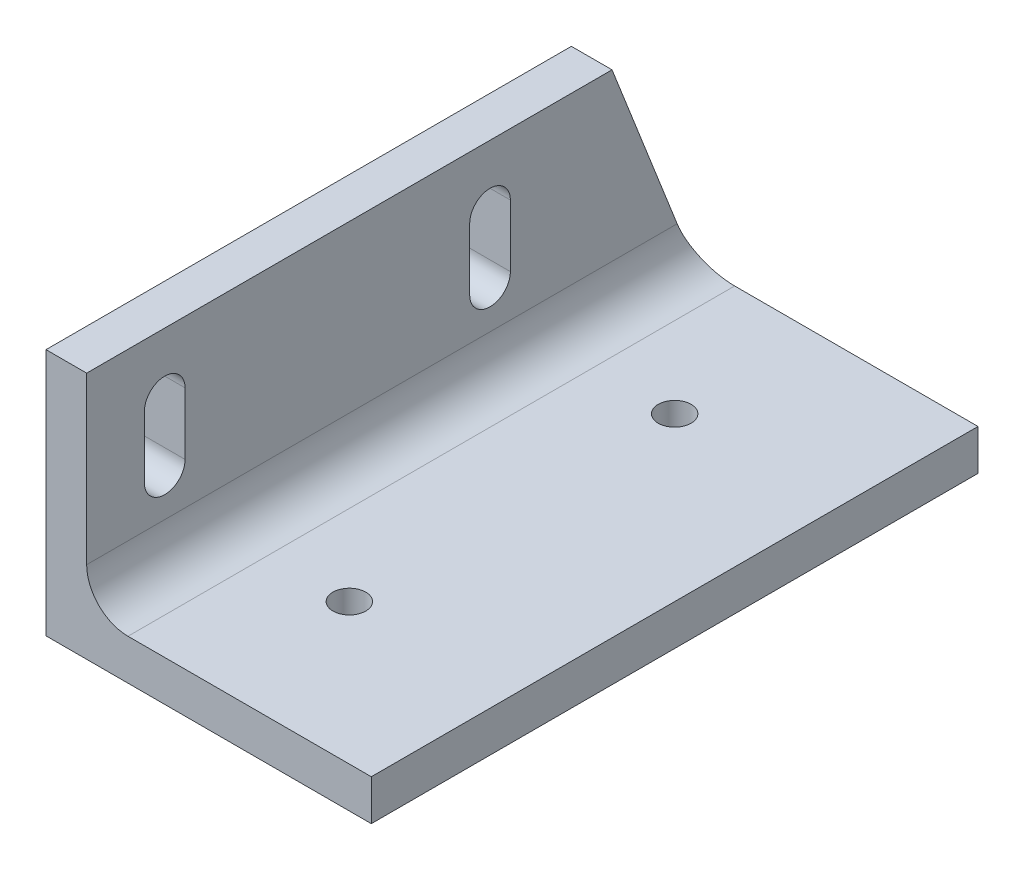
ISO-10303-21;
HEADER;
FILE_DESCRIPTION(('STEP AP214'),'2;1');
FILE_NAME('part.step','',(''),(''),'','','');
FILE_SCHEMA(('AUTOMOTIVE_DESIGN { 1 0 10303 214 1 1 1 1 }'));
ENDSEC;
DATA;
#1=APPLICATION_CONTEXT('core data for automotive mechanical design processes');
#2=APPLICATION_PROTOCOL_DEFINITION('international standard','automotive_design',2000,#1);
#3=PRODUCT_CONTEXT('',#1,'mechanical');
#4=PRODUCT('Part','Part','',(#3));
#5=PRODUCT_RELATED_PRODUCT_CATEGORY('part','',(#4));
#6=PRODUCT_DEFINITION_FORMATION('','',#4);
#7=PRODUCT_DEFINITION_CONTEXT('part definition',#1,'design');
#8=PRODUCT_DEFINITION('design','',#6,#7);
#9=PRODUCT_DEFINITION_SHAPE('','',#8);
#10=(LENGTH_UNIT() NAMED_UNIT(*) SI_UNIT(.MILLI.,.METRE.));
#11=(NAMED_UNIT(*) PLANE_ANGLE_UNIT() SI_UNIT($,.RADIAN.));
#12=(NAMED_UNIT(*) SI_UNIT($,.STERADIAN.) SOLID_ANGLE_UNIT());
#13=UNCERTAINTY_MEASURE_WITH_UNIT(LENGTH_MEASURE(1.E-05),#10,'distance_accuracy_value','');
#14=(GEOMETRIC_REPRESENTATION_CONTEXT(3) GLOBAL_UNCERTAINTY_ASSIGNED_CONTEXT((#13)) GLOBAL_UNIT_ASSIGNED_CONTEXT((#10,
#11,#12)) REPRESENTATION_CONTEXT('',''));
#15=CARTESIAN_POINT('',(0.,0.,0.));
#16=DIRECTION('',(0.,0.,1.));
#17=DIRECTION('',(1.,0.,0.));
#18=AXIS2_PLACEMENT_3D('',#15,#16,#17);
#19=CARTESIAN_POINT('',(-5.,25.48,74.6));
#20=DIRECTION('',(0.,-1.,0.));
#21=DIRECTION('',(0.,0.,-1.));
#22=AXIS2_PLACEMENT_3D('',#19,#20,#21);
#23=PLANE('',#22);
#24=DIRECTION('',(1.,0.,0.));
#25=VECTOR('',#24,1.);
#26=CARTESIAN_POINT('',(-10.,25.48,10.));
#27=LINE('',#26,#25);
#28=CARTESIAN_POINT('',(-5.,25.48,10.));
#29=VERTEX_POINT('',#28);
#30=CARTESIAN_POINT('',(0.,25.48,10.));
#31=VERTEX_POINT('',#30);
#32=EDGE_CURVE('E158',#29,#31,#27,.T.);
#33=ORIENTED_EDGE('',*,*,#32,.F.);
#34=DIRECTION('',(0.,0.,-1.));
#35=VECTOR('',#34,1.);
#36=CARTESIAN_POINT('',(-5.,25.48,74.6));
#37=LINE('',#36,#35);
#38=CARTESIAN_POINT('',(-5.,25.48,74.6));
#39=VERTEX_POINT('',#38);
#40=EDGE_CURVE('E188',#39,#29,#37,.T.);
#41=ORIENTED_EDGE('',*,*,#40,.F.);
#42=DIRECTION('',(-1.,0.,0.));
#43=VECTOR('',#42,1.);
#44=CARTESIAN_POINT('',(-5.,25.48,74.6));
#45=LINE('',#44,#43);
#46=CARTESIAN_POINT('',(0.,25.48,74.6));
#47=VERTEX_POINT('',#46);
#48=EDGE_CURVE('E170',#47,#39,#45,.T.);
#49=ORIENTED_EDGE('',*,*,#48,.F.);
#50=DIRECTION('',(0.,0.,-1.));
#51=VECTOR('',#50,1.);
#52=CARTESIAN_POINT('',(0.,25.48,74.6));
#53=LINE('',#52,#51);
#54=EDGE_CURVE('E152',#47,#31,#53,.T.);
#55=ORIENTED_EDGE('',*,*,#54,.T.);
#56=EDGE_LOOP('',(#33,#41,#49,#55));
#57=FACE_BOUND('',#56,.T.);
#58=ADVANCED_FACE('F35',(#57),#23,.F.);
#59=CARTESIAN_POINT('',(-5.,-5.,74.6));
#60=DIRECTION('',(1.,0.,0.));
#61=DIRECTION('',(0.,0.,-1.));
#62=AXIS2_PLACEMENT_3D('',#59,#60,#61);
#63=PLANE('',#62);
#64=DIRECTION('',(0.,-1.,0.));
#65=VECTOR('',#64,1.);
#66=CARTESIAN_POINT('',(-5.,10.24,67.5000000000004));
#67=LINE('',#66,#65);
#68=CARTESIAN_POINT('',(-5.,17.86,67.5000000000004));
#69=VERTEX_POINT('',#68);
#70=CARTESIAN_POINT('',(-5.,10.24,67.5000000000004));
#71=VERTEX_POINT('',#70);
#72=EDGE_CURVE('E273',#69,#71,#67,.T.);
#73=ORIENTED_EDGE('',*,*,#72,.T.);
#74=CARTESIAN_POINT('',(-5.,10.24,65.0000000000004));
#75=DIRECTION('',(1.,0.,0.));
#76=DIRECTION('',(0.,1.,0.));
#77=AXIS2_PLACEMENT_3D('',#74,#75,#76);
#78=CIRCLE('',#77,2.5);
#79=CARTESIAN_POINT('',(-5.,10.24,62.5000000000004));
#80=VERTEX_POINT('',#79);
#81=EDGE_CURVE('E263',#71,#80,#78,.T.);
#82=ORIENTED_EDGE('',*,*,#81,.T.);
#83=DIRECTION('',(0.,1.,0.));
#84=VECTOR('',#83,1.);
#85=CARTESIAN_POINT('',(-5.,10.24,62.5000000000004));
#86=LINE('',#85,#84);
#87=CARTESIAN_POINT('',(-5.,17.86,62.5000000000004));
#88=VERTEX_POINT('',#87);
#89=EDGE_CURVE('E266',#80,#88,#86,.T.);
#90=ORIENTED_EDGE('',*,*,#89,.T.);
#91=CARTESIAN_POINT('',(-5.,17.86,65.0000000000004));
#92=DIRECTION('',(1.,0.,0.));
#93=DIRECTION('',(0.,1.,0.));
#94=AXIS2_PLACEMENT_3D('',#91,#92,#93);
#95=CIRCLE('',#94,2.5);
#96=EDGE_CURVE('E270',#88,#69,#95,.T.);
#97=ORIENTED_EDGE('',*,*,#96,.T.);
#98=EDGE_LOOP('',(#73,#82,#90,#97));
#99=FACE_BOUND('',#98,.T.);
#100=DIRECTION('',(0.,-1.,0.));
#101=VECTOR('',#100,1.);
#102=CARTESIAN_POINT('',(-5.,10.24,27.5));
#103=LINE('',#102,#101);
#104=CARTESIAN_POINT('',(-5.,17.86,27.5));
#105=VERTEX_POINT('',#104);
#106=CARTESIAN_POINT('',(-5.,10.24,27.5));
#107=VERTEX_POINT('',#106);
#108=EDGE_CURVE('E243',#105,#107,#103,.T.);
#109=ORIENTED_EDGE('',*,*,#108,.T.);
#110=CARTESIAN_POINT('',(-5.,10.24,25.));
#111=DIRECTION('',(1.,0.,0.));
#112=DIRECTION('',(0.,1.,0.));
#113=AXIS2_PLACEMENT_3D('',#110,#111,#112);
#114=CIRCLE('',#113,2.5);
#115=CARTESIAN_POINT('',(-5.,10.24,22.5));
#116=VERTEX_POINT('',#115);
#117=EDGE_CURVE('E233',#107,#116,#114,.T.);
#118=ORIENTED_EDGE('',*,*,#117,.T.);
#119=DIRECTION('',(0.,1.,0.));
#120=VECTOR('',#119,1.);
#121=CARTESIAN_POINT('',(-5.,10.24,22.5));
#122=LINE('',#121,#120);
#123=CARTESIAN_POINT('',(-5.,17.86,22.5));
#124=VERTEX_POINT('',#123);
#125=EDGE_CURVE('E236',#116,#124,#122,.T.);
#126=ORIENTED_EDGE('',*,*,#125,.T.);
#127=CARTESIAN_POINT('',(-5.,17.86,25.));
#128=DIRECTION('',(1.,0.,0.));
#129=DIRECTION('',(0.,1.,0.));
#130=AXIS2_PLACEMENT_3D('',#127,#128,#129);
#131=CIRCLE('',#130,2.5);
#132=EDGE_CURVE('E240',#124,#105,#131,.T.);
#133=ORIENTED_EDGE('',*,*,#132,.T.);
#134=EDGE_LOOP('',(#109,#118,#126,#133));
#135=FACE_BOUND('',#134,.T.);
#136=DIRECTION('',(0.,0.930875774929929,0.365335861432468));
#137=VECTOR('',#136,1.);
#138=CARTESIAN_POINT('',(-5.,21.0374912710429,8.25647224138261));
#139=LINE('',#138,#137);
#140=CARTESIAN_POINT('',(-5.,0.,0.));
#141=VERTEX_POINT('',#140);
#142=EDGE_CURVE('E164',#141,#29,#139,.T.);
#143=ORIENTED_EDGE('',*,*,#142,.F.);
#144=DIRECTION('',(0.,-1.,0.));
#145=VECTOR('',#144,1.);
#146=CARTESIAN_POINT('',(-5.,-5.,0.));
#147=LINE('',#146,#145);
#148=CARTESIAN_POINT('',(-5.,-5.,0.));
#149=VERTEX_POINT('',#148);
#150=EDGE_CURVE('E204',#141,#149,#147,.T.);
#151=ORIENTED_EDGE('',*,*,#150,.T.);
#152=DIRECTION('',(0.,0.,-1.));
#153=VECTOR('',#152,1.);
#154=CARTESIAN_POINT('',(-5.,-5.,74.6));
#155=LINE('',#154,#153);
#156=CARTESIAN_POINT('',(-5.,-5.,74.6));
#157=VERTEX_POINT('',#156);
#158=EDGE_CURVE('E185',#157,#149,#155,.T.);
#159=ORIENTED_EDGE('',*,*,#158,.F.);
#160=DIRECTION('',(0.,-1.,0.));
#161=VECTOR('',#160,1.);
#162=CARTESIAN_POINT('',(-5.,-5.,74.6));
#163=LINE('',#162,#161);
#164=EDGE_CURVE('E211',#39,#157,#163,.T.);
#165=ORIENTED_EDGE('',*,*,#164,.F.);
#166=ORIENTED_EDGE('',*,*,#40,.T.);
#167=EDGE_LOOP('',(#143,#151,#159,#165,#166));
#168=FACE_BOUND('',#167,.T.);
#169=ADVANCED_FACE('F227',(#99,#135,#168),#63,.F.);
#170=CARTESIAN_POINT('',(0.,25.48,74.6));
#171=DIRECTION('',(-1.,0.,0.));
#172=DIRECTION('',(0.,-1.,0.));
#173=AXIS2_PLACEMENT_3D('',#170,#171,#172);
#174=PLANE('',#173);
#175=DIRECTION('',(0.,1.,0.));
#176=VECTOR('',#175,1.);
#177=CARTESIAN_POINT('',(0.,10.24,62.5000000000004));
#178=LINE('',#177,#176);
#179=CARTESIAN_POINT('',(0.,10.24,62.5000000000004));
#180=VERTEX_POINT('',#179);
#181=CARTESIAN_POINT('',(0.,17.86,62.5000000000004));
#182=VERTEX_POINT('',#181);
#183=EDGE_CURVE('E277',#180,#182,#178,.T.);
#184=ORIENTED_EDGE('',*,*,#183,.F.);
#185=CARTESIAN_POINT('',(0.,10.24,65.0000000000004));
#186=DIRECTION('',(1.,0.,0.));
#187=DIRECTION('',(0.,1.,0.));
#188=AXIS2_PLACEMENT_3D('',#185,#186,#187);
#189=CIRCLE('',#188,2.5);
#190=CARTESIAN_POINT('',(0.,10.24,67.5000000000004));
#191=VERTEX_POINT('',#190);
#192=EDGE_CURVE('E256',#191,#180,#189,.T.);
#193=ORIENTED_EDGE('',*,*,#192,.F.);
#194=DIRECTION('',(0.,-1.,0.));
#195=VECTOR('',#194,1.);
#196=CARTESIAN_POINT('',(0.,10.24,67.5000000000004));
#197=LINE('',#196,#195);
#198=CARTESIAN_POINT('',(0.,17.86,67.5000000000004));
#199=VERTEX_POINT('',#198);
#200=EDGE_CURVE('E267',#199,#191,#197,.T.);
#201=ORIENTED_EDGE('',*,*,#200,.F.);
#202=CARTESIAN_POINT('',(0.,17.86,65.0000000000004));
#203=DIRECTION('',(1.,0.,0.));
#204=DIRECTION('',(0.,1.,0.));
#205=AXIS2_PLACEMENT_3D('',#202,#203,#204);
#206=CIRCLE('',#205,2.5);
#207=EDGE_CURVE('E280',#182,#199,#206,.T.);
#208=ORIENTED_EDGE('',*,*,#207,.F.);
#209=EDGE_LOOP('',(#184,#193,#201,#208));
#210=FACE_BOUND('',#209,.T.);
#211=DIRECTION('',(0.,1.,0.));
#212=VECTOR('',#211,1.);
#213=CARTESIAN_POINT('',(0.,10.24,22.5));
#214=LINE('',#213,#212);
#215=CARTESIAN_POINT('',(0.,10.24,22.5));
#216=VERTEX_POINT('',#215);
#217=CARTESIAN_POINT('',(0.,17.86,22.5));
#218=VERTEX_POINT('',#217);
#219=EDGE_CURVE('E230',#216,#218,#214,.T.);
#220=ORIENTED_EDGE('',*,*,#219,.F.);
#221=CARTESIAN_POINT('',(0.,10.24,25.));
#222=DIRECTION('',(1.,0.,0.));
#223=DIRECTION('',(0.,1.,0.));
#224=AXIS2_PLACEMENT_3D('',#221,#222,#223);
#225=CIRCLE('',#224,2.5);
#226=CARTESIAN_POINT('',(0.,10.24,27.5));
#227=VERTEX_POINT('',#226);
#228=EDGE_CURVE('E228',#227,#216,#225,.T.);
#229=ORIENTED_EDGE('',*,*,#228,.F.);
#230=DIRECTION('',(0.,-1.,0.));
#231=VECTOR('',#230,1.);
#232=CARTESIAN_POINT('',(0.,10.24,27.5));
#233=LINE('',#232,#231);
#234=CARTESIAN_POINT('',(0.,17.86,27.5));
#235=VERTEX_POINT('',#234);
#236=EDGE_CURVE('E237',#235,#227,#233,.T.);
#237=ORIENTED_EDGE('',*,*,#236,.F.);
#238=CARTESIAN_POINT('',(0.,17.86,25.));
#239=DIRECTION('',(1.,0.,0.));
#240=DIRECTION('',(0.,1.,0.));
#241=AXIS2_PLACEMENT_3D('',#238,#239,#240);
#242=CIRCLE('',#241,2.5);
#243=EDGE_CURVE('E249',#218,#235,#242,.T.);
#244=ORIENTED_EDGE('',*,*,#243,.F.);
#245=EDGE_LOOP('',(#220,#229,#237,#244));
#246=FACE_BOUND('',#245,.T.);
#247=DIRECTION('',(0.,1.,0.));
#248=VECTOR('',#247,1.);
#249=CARTESIAN_POINT('',(0.,25.48,74.6));
#250=LINE('',#249,#248);
#251=CARTESIAN_POINT('',(0.,5.08000000000001,74.6));
#252=VERTEX_POINT('',#251);
#253=EDGE_CURVE('E172',#252,#47,#250,.T.);
#254=ORIENTED_EDGE('',*,*,#253,.F.);
#255=DIRECTION('',(0.,0.,-1.));
#256=VECTOR('',#255,1.);
#257=CARTESIAN_POINT('',(0.,5.08,0.));
#258=LINE('',#257,#256);
#259=CARTESIAN_POINT('',(0.,5.08,1.99372056514914));
#260=VERTEX_POINT('',#259);
#261=EDGE_CURVE('E155',#252,#260,#258,.T.);
#262=ORIENTED_EDGE('',*,*,#261,.T.);
#263=DIRECTION('',(0.,0.930875774929929,0.365335861432468));
#264=VECTOR('',#263,1.);
#265=CARTESIAN_POINT('',(0.,0.,0.));
#266=LINE('',#265,#264);
#267=EDGE_CURVE('E147',#260,#31,#266,.T.);
#268=ORIENTED_EDGE('',*,*,#267,.T.);
#269=ORIENTED_EDGE('',*,*,#54,.F.);
#270=EDGE_LOOP('',(#254,#262,#268,#269));
#271=FACE_BOUND('',#270,.T.);
#272=ADVANCED_FACE('F150',(#210,#246,#271),#174,.F.);
#273=CARTESIAN_POINT('',(0.,0.,0.));
#274=DIRECTION('',(0.,0.,-1.));
#275=DIRECTION('',(-1.,0.,0.));
#276=AXIS2_PLACEMENT_3D('',#273,#274,#275);
#277=PLANE('',#276);
#278=ORIENTED_EDGE('',*,*,#150,.F.);
#279=DIRECTION('',(1.,0.,0.));
#280=VECTOR('',#279,1.);
#281=CARTESIAN_POINT('',(0.,0.,0.));
#282=LINE('',#281,#280);
#283=CARTESIAN_POINT('',(5.08,0.,0.));
#284=VERTEX_POINT('',#283);
#285=EDGE_CURVE('E50',#141,#284,#282,.T.);
#286=ORIENTED_EDGE('',*,*,#285,.T.);
#287=DIRECTION('',(-1.,0.,0.));
#288=VECTOR('',#287,1.);
#289=CARTESIAN_POINT('',(0.,0.,0.));
#290=LINE('',#289,#288);
#291=CARTESIAN_POINT('',(35.,0.,0.));
#292=VERTEX_POINT('',#291);
#293=EDGE_CURVE('E180',#292,#284,#290,.T.);
#294=ORIENTED_EDGE('',*,*,#293,.F.);
#295=DIRECTION('',(0.,1.,0.));
#296=VECTOR('',#295,1.);
#297=CARTESIAN_POINT('',(35.,0.,0.));
#298=LINE('',#297,#296);
#299=CARTESIAN_POINT('',(35.,-4.99999999999999,0.));
#300=VERTEX_POINT('',#299);
#301=EDGE_CURVE('E208',#300,#292,#298,.T.);
#302=ORIENTED_EDGE('',*,*,#301,.F.);
#303=DIRECTION('',(1.,0.,0.));
#304=VECTOR('',#303,1.);
#305=CARTESIAN_POINT('',(35.,-4.99999999999999,0.));
#306=LINE('',#305,#304);
#307=EDGE_CURVE('E206',#149,#300,#306,.T.);
#308=ORIENTED_EDGE('',*,*,#307,.F.);
#309=EDGE_LOOP('',(#278,#286,#294,#302,#308));
#310=FACE_BOUND('',#309,.T.);
#311=ADVANCED_FACE('F225',(#310),#277,.T.);
#312=CARTESIAN_POINT('',(35.,-4.99999999999999,74.6));
#313=DIRECTION('',(0.,1.,0.));
#314=DIRECTION('',(-1.,0.,0.));
#315=AXIS2_PLACEMENT_3D('',#312,#313,#314);
#316=PLANE('',#315);
#317=CARTESIAN_POINT('',(15.,-4.99999999999999,17.3));
#318=DIRECTION('',(0.,1.,0.));
#319=DIRECTION('',(0.,0.,1.));
#320=AXIS2_PLACEMENT_3D('',#317,#318,#319);
#321=CIRCLE('',#320,2.0193);
#322=CARTESIAN_POINT('',(15.,-4.99999999999999,19.3193));
#323=VERTEX_POINT('',#322);
#324=EDGE_CURVE('E490',#323,#323,#321,.T.);
#325=ORIENTED_EDGE('',*,*,#324,.T.);
#326=EDGE_LOOP('',(#325));
#327=FACE_BOUND('',#326,.T.);
#328=CARTESIAN_POINT('',(15.,-4.99999999999999,57.3));
#329=DIRECTION('',(0.,1.,0.));
#330=DIRECTION('',(0.,0.,1.));
#331=AXIS2_PLACEMENT_3D('',#328,#329,#330);
#332=CIRCLE('',#331,2.0193);
#333=CARTESIAN_POINT('',(15.,-4.99999999999999,59.3193));
#334=VERTEX_POINT('',#333);
#335=EDGE_CURVE('E159',#334,#334,#332,.T.);
#336=ORIENTED_EDGE('',*,*,#335,.T.);
#337=EDGE_LOOP('',(#336));
#338=FACE_BOUND('',#337,.T.);
#339=ORIENTED_EDGE('',*,*,#307,.T.);
#340=DIRECTION('',(0.,0.,-1.));
#341=VECTOR('',#340,1.);
#342=CARTESIAN_POINT('',(35.,-4.99999999999999,74.6));
#343=LINE('',#342,#341);
#344=CARTESIAN_POINT('',(35.,-4.99999999999999,74.6));
#345=VERTEX_POINT('',#344);
#346=EDGE_CURVE('E175',#345,#300,#343,.T.);
#347=ORIENTED_EDGE('',*,*,#346,.F.);
#348=DIRECTION('',(1.,0.,0.));
#349=VECTOR('',#348,1.);
#350=CARTESIAN_POINT('',(35.,-4.99999999999999,74.6));
#351=LINE('',#350,#349);
#352=EDGE_CURVE('E200',#157,#345,#351,.T.);
#353=ORIENTED_EDGE('',*,*,#352,.F.);
#354=ORIENTED_EDGE('',*,*,#158,.T.);
#355=EDGE_LOOP('',(#339,#347,#353,#354));
#356=FACE_BOUND('',#355,.T.);
#357=ADVANCED_FACE('F221',(#327,#338,#356),#316,.F.);
#358=CARTESIAN_POINT('',(35.,0.,74.6));
#359=DIRECTION('',(-1.,0.,0.));
#360=DIRECTION('',(0.,0.,1.));
#361=AXIS2_PLACEMENT_3D('',#358,#359,#360);
#362=PLANE('',#361);
#363=ORIENTED_EDGE('',*,*,#301,.T.);
#364=DIRECTION('',(0.,0.,-1.));
#365=VECTOR('',#364,1.);
#366=CARTESIAN_POINT('',(35.,0.,74.6));
#367=LINE('',#366,#365);
#368=CARTESIAN_POINT('',(35.,0.,74.6));
#369=VERTEX_POINT('',#368);
#370=EDGE_CURVE('E171',#369,#292,#367,.T.);
#371=ORIENTED_EDGE('',*,*,#370,.F.);
#372=DIRECTION('',(0.,1.,0.));
#373=VECTOR('',#372,1.);
#374=CARTESIAN_POINT('',(35.,0.,74.6));
#375=LINE('',#374,#373);
#376=EDGE_CURVE('E197',#345,#369,#375,.T.);
#377=ORIENTED_EDGE('',*,*,#376,.F.);
#378=ORIENTED_EDGE('',*,*,#346,.T.);
#379=EDGE_LOOP('',(#363,#371,#377,#378));
#380=FACE_BOUND('',#379,.T.);
#381=ADVANCED_FACE('F223',(#380),#362,.F.);
#382=CARTESIAN_POINT('',(0.,0.,74.6));
#383=DIRECTION('',(0.,-1.,0.));
#384=DIRECTION('',(0.,0.,-1.));
#385=AXIS2_PLACEMENT_3D('',#382,#383,#384);
#386=PLANE('',#385);
#387=CARTESIAN_POINT('',(15.,0.,17.3));
#388=DIRECTION('',(0.,1.,0.));
#389=DIRECTION('',(0.,0.,1.));
#390=AXIS2_PLACEMENT_3D('',#387,#388,#389);
#391=CIRCLE('',#390,2.0193);
#392=CARTESIAN_POINT('',(15.,0.,19.3193));
#393=VERTEX_POINT('',#392);
#394=EDGE_CURVE('E493',#393,#393,#391,.T.);
#395=ORIENTED_EDGE('',*,*,#394,.F.);
#396=EDGE_LOOP('',(#395));
#397=FACE_BOUND('',#396,.T.);
#398=CARTESIAN_POINT('',(15.,0.,57.3));
#399=DIRECTION('',(0.,1.,0.));
#400=DIRECTION('',(0.,0.,1.));
#401=AXIS2_PLACEMENT_3D('',#398,#399,#400);
#402=CIRCLE('',#401,2.0193);
#403=CARTESIAN_POINT('',(15.,0.,59.3193));
#404=VERTEX_POINT('',#403);
#405=EDGE_CURVE('E495',#404,#404,#402,.T.);
#406=ORIENTED_EDGE('',*,*,#405,.F.);
#407=EDGE_LOOP('',(#406));
#408=FACE_BOUND('',#407,.T.);
#409=ORIENTED_EDGE('',*,*,#293,.T.);
#410=DIRECTION('',(0.,0.,-1.));
#411=VECTOR('',#410,1.);
#412=CARTESIAN_POINT('',(5.08,0.,74.6));
#413=LINE('',#412,#411);
#414=CARTESIAN_POINT('',(5.08,0.,74.6));
#415=VERTEX_POINT('',#414);
#416=EDGE_CURVE('E57',#284,#415,#413,.F.);
#417=ORIENTED_EDGE('',*,*,#416,.T.);
#418=DIRECTION('',(-1.,0.,0.));
#419=VECTOR('',#418,1.);
#420=CARTESIAN_POINT('',(0.,0.,74.6));
#421=LINE('',#420,#419);
#422=EDGE_CURVE('E177',#369,#415,#421,.T.);
#423=ORIENTED_EDGE('',*,*,#422,.F.);
#424=ORIENTED_EDGE('',*,*,#370,.T.);
#425=EDGE_LOOP('',(#409,#417,#423,#424));
#426=FACE_BOUND('',#425,.T.);
#427=ADVANCED_FACE('F224',(#397,#408,#426),#386,.F.);
#428=CARTESIAN_POINT('',(0.,0.,74.6));
#429=DIRECTION('',(0.,0.,-1.));
#430=DIRECTION('',(-1.,0.,0.));
#431=AXIS2_PLACEMENT_3D('',#428,#429,#430);
#432=PLANE('',#431);
#433=ORIENTED_EDGE('',*,*,#48,.T.);
#434=ORIENTED_EDGE('',*,*,#164,.T.);
#435=ORIENTED_EDGE('',*,*,#352,.T.);
#436=ORIENTED_EDGE('',*,*,#376,.T.);
#437=ORIENTED_EDGE('',*,*,#422,.T.);
#438=CARTESIAN_POINT('',(5.08,5.08,74.6));
#439=DIRECTION('',(0.,0.,-1.));
#440=DIRECTION('',(-1.,0.,0.));
#441=AXIS2_PLACEMENT_3D('',#438,#439,#440);
#442=CIRCLE('',#441,5.08);
#443=EDGE_CURVE('E11',#415,#252,#442,.T.);
#444=ORIENTED_EDGE('',*,*,#443,.T.);
#445=ORIENTED_EDGE('',*,*,#253,.T.);
#446=EDGE_LOOP('',(#433,#434,#435,#436,#437,#444,#445));
#447=FACE_BOUND('',#446,.T.);
#448=ADVANCED_FACE('F195',(#447),#432,.F.);
#449=CARTESIAN_POINT('',(-5.,10.24,65.0000000000004));
#450=DIRECTION('',(1.,0.,0.));
#451=DIRECTION('',(0.,1.,0.));
#452=AXIS2_PLACEMENT_3D('',#449,#450,#451);
#453=CYLINDRICAL_SURFACE('',#452,2.5);
#454=ORIENTED_EDGE('',*,*,#192,.T.);
#455=DIRECTION('',(1.,0.,0.));
#456=VECTOR('',#455,1.);
#457=CARTESIAN_POINT('',(-5.,10.24,62.5000000000004));
#458=LINE('',#457,#456);
#459=EDGE_CURVE('E215',#80,#180,#458,.T.);
#460=ORIENTED_EDGE('',*,*,#459,.F.);
#461=ORIENTED_EDGE('',*,*,#81,.F.);
#462=DIRECTION('',(1.,0.,0.));
#463=VECTOR('',#462,1.);
#464=CARTESIAN_POINT('',(-5.,10.24,67.5000000000004));
#465=LINE('',#464,#463);
#466=EDGE_CURVE('E207',#71,#191,#465,.T.);
#467=ORIENTED_EDGE('',*,*,#466,.T.);
#468=EDGE_LOOP('',(#454,#460,#461,#467));
#469=FACE_BOUND('',#468,.T.);
#470=ADVANCED_FACE('F308',(#469),#453,.F.);
#471=CARTESIAN_POINT('',(-5.,10.24,67.5000000000004));
#472=DIRECTION('',(0.,0.,1.));
#473=DIRECTION('',(1.,0.,0.));
#474=AXIS2_PLACEMENT_3D('',#471,#472,#473);
#475=PLANE('',#474);
#476=ORIENTED_EDGE('',*,*,#200,.T.);
#477=ORIENTED_EDGE('',*,*,#466,.F.);
#478=ORIENTED_EDGE('',*,*,#72,.F.);
#479=DIRECTION('',(1.,0.,0.));
#480=VECTOR('',#479,1.);
#481=CARTESIAN_POINT('',(-5.,17.86,67.5000000000004));
#482=LINE('',#481,#480);
#483=EDGE_CURVE('E286',#69,#199,#482,.T.);
#484=ORIENTED_EDGE('',*,*,#483,.T.);
#485=EDGE_LOOP('',(#476,#477,#478,#484));
#486=FACE_BOUND('',#485,.T.);
#487=ADVANCED_FACE('F305',(#486),#475,.F.);
#488=CARTESIAN_POINT('',(-5.,17.86,65.0000000000004));
#489=DIRECTION('',(1.,0.,0.));
#490=DIRECTION('',(0.,1.,0.));
#491=AXIS2_PLACEMENT_3D('',#488,#489,#490);
#492=CYLINDRICAL_SURFACE('',#491,2.5);
#493=ORIENTED_EDGE('',*,*,#207,.T.);
#494=ORIENTED_EDGE('',*,*,#483,.F.);
#495=ORIENTED_EDGE('',*,*,#96,.F.);
#496=DIRECTION('',(1.,0.,0.));
#497=VECTOR('',#496,1.);
#498=CARTESIAN_POINT('',(-5.,17.86,62.5000000000004));
#499=LINE('',#498,#497);
#500=EDGE_CURVE('E287',#88,#182,#499,.T.);
#501=ORIENTED_EDGE('',*,*,#500,.T.);
#502=EDGE_LOOP('',(#493,#494,#495,#501));
#503=FACE_BOUND('',#502,.T.);
#504=ADVANCED_FACE('F302',(#503),#492,.F.);
#505=CARTESIAN_POINT('',(-5.,10.24,62.5000000000004));
#506=DIRECTION('',(0.,0.,-1.));
#507=DIRECTION('',(-1.,0.,0.));
#508=AXIS2_PLACEMENT_3D('',#505,#506,#507);
#509=PLANE('',#508);
#510=ORIENTED_EDGE('',*,*,#183,.T.);
#511=ORIENTED_EDGE('',*,*,#500,.F.);
#512=ORIENTED_EDGE('',*,*,#89,.F.);
#513=ORIENTED_EDGE('',*,*,#459,.T.);
#514=EDGE_LOOP('',(#510,#511,#512,#513));
#515=FACE_BOUND('',#514,.T.);
#516=ADVANCED_FACE('F294',(#515),#509,.F.);
#517=CARTESIAN_POINT('',(-5.,10.24,25.));
#518=DIRECTION('',(1.,0.,0.));
#519=DIRECTION('',(0.,1.,0.));
#520=AXIS2_PLACEMENT_3D('',#517,#518,#519);
#521=CYLINDRICAL_SURFACE('',#520,2.5);
#522=ORIENTED_EDGE('',*,*,#228,.T.);
#523=DIRECTION('',(1.,0.,0.));
#524=VECTOR('',#523,1.);
#525=CARTESIAN_POINT('',(-5.,10.24,22.5));
#526=LINE('',#525,#524);
#527=EDGE_CURVE('E245',#116,#216,#526,.T.);
#528=ORIENTED_EDGE('',*,*,#527,.F.);
#529=ORIENTED_EDGE('',*,*,#117,.F.);
#530=DIRECTION('',(1.,0.,0.));
#531=VECTOR('',#530,1.);
#532=CARTESIAN_POINT('',(-5.,10.24,27.5));
#533=LINE('',#532,#531);
#534=EDGE_CURVE('E254',#107,#227,#533,.T.);
#535=ORIENTED_EDGE('',*,*,#534,.T.);
#536=EDGE_LOOP('',(#522,#528,#529,#535));
#537=FACE_BOUND('',#536,.T.);
#538=ADVANCED_FACE('F409',(#537),#521,.F.);
#539=CARTESIAN_POINT('',(-5.,10.24,27.5));
#540=DIRECTION('',(0.,0.,1.));
#541=DIRECTION('',(1.,0.,0.));
#542=AXIS2_PLACEMENT_3D('',#539,#540,#541);
#543=PLANE('',#542);
#544=ORIENTED_EDGE('',*,*,#236,.T.);
#545=ORIENTED_EDGE('',*,*,#534,.F.);
#546=ORIENTED_EDGE('',*,*,#108,.F.);
#547=DIRECTION('',(1.,0.,0.));
#548=VECTOR('',#547,1.);
#549=CARTESIAN_POINT('',(-5.,17.86,27.5));
#550=LINE('',#549,#548);
#551=EDGE_CURVE('E257',#105,#235,#550,.T.);
#552=ORIENTED_EDGE('',*,*,#551,.T.);
#553=EDGE_LOOP('',(#544,#545,#546,#552));
#554=FACE_BOUND('',#553,.T.);
#555=ADVANCED_FACE('F405',(#554),#543,.F.);
#556=CARTESIAN_POINT('',(-5.,17.86,25.));
#557=DIRECTION('',(1.,0.,0.));
#558=DIRECTION('',(0.,1.,0.));
#559=AXIS2_PLACEMENT_3D('',#556,#557,#558);
#560=CYLINDRICAL_SURFACE('',#559,2.5);
#561=ORIENTED_EDGE('',*,*,#243,.T.);
#562=ORIENTED_EDGE('',*,*,#551,.F.);
#563=ORIENTED_EDGE('',*,*,#132,.F.);
#564=DIRECTION('',(1.,0.,0.));
#565=VECTOR('',#564,1.);
#566=CARTESIAN_POINT('',(-5.,17.86,22.5));
#567=LINE('',#566,#565);
#568=EDGE_CURVE('E259',#124,#218,#567,.T.);
#569=ORIENTED_EDGE('',*,*,#568,.T.);
#570=EDGE_LOOP('',(#561,#562,#563,#569));
#571=FACE_BOUND('',#570,.T.);
#572=ADVANCED_FACE('F408',(#571),#560,.F.);
#573=CARTESIAN_POINT('',(-5.,10.24,22.5));
#574=DIRECTION('',(0.,0.,-1.));
#575=DIRECTION('',(-1.,0.,0.));
#576=AXIS2_PLACEMENT_3D('',#573,#574,#575);
#577=PLANE('',#576);
#578=ORIENTED_EDGE('',*,*,#219,.T.);
#579=ORIENTED_EDGE('',*,*,#568,.F.);
#580=ORIENTED_EDGE('',*,*,#125,.F.);
#581=ORIENTED_EDGE('',*,*,#527,.T.);
#582=EDGE_LOOP('',(#578,#579,#580,#581));
#583=FACE_BOUND('',#582,.T.);
#584=ADVANCED_FACE('F366',(#583),#577,.F.);
#585=CARTESIAN_POINT('',(-10.,0.,0.));
#586=DIRECTION('',(0.,0.365335861432468,-0.930875774929929));
#587=DIRECTION('',(0.,0.930875774929929,0.365335861432468));
#588=AXIS2_PLACEMENT_3D('',#585,#586,#587);
#589=PLANE('',#588);
#590=ORIENTED_EDGE('',*,*,#142,.T.);
#591=ORIENTED_EDGE('',*,*,#32,.T.);
#592=ORIENTED_EDGE('',*,*,#267,.F.);
#593=CARTESIAN_POINT('',(5.08,5.08,1.99372056514913));
#594=DIRECTION('',(0.,0.365335861432468,-0.930875774929929));
#595=DIRECTION('',(0.,0.930875774929929,0.365335861432468));
#596=AXIS2_PLACEMENT_3D('',#593,#594,#595);
#597=ELLIPSE('',#596,5.45722655676843,5.08);
#598=EDGE_CURVE('E43',#260,#284,#597,.F.);
#599=ORIENTED_EDGE('',*,*,#598,.T.);
#600=ORIENTED_EDGE('',*,*,#285,.F.);
#601=EDGE_LOOP('',(#590,#591,#592,#599,#600));
#602=FACE_BOUND('',#601,.T.);
#603=ADVANCED_FACE('F162',(#602),#589,.T.);
#604=CARTESIAN_POINT('',(5.08,5.08,74.6));
#605=DIRECTION('',(0.,0.,1.));
#606=DIRECTION('',(1.,0.,0.));
#607=AXIS2_PLACEMENT_3D('',#604,#605,#606);
#608=CYLINDRICAL_SURFACE('',#607,5.08);
#609=ORIENTED_EDGE('',*,*,#443,.F.);
#610=ORIENTED_EDGE('',*,*,#416,.F.);
#611=ORIENTED_EDGE('',*,*,#598,.F.);
#612=ORIENTED_EDGE('',*,*,#261,.F.);
#613=EDGE_LOOP('',(#609,#610,#611,#612));
#614=FACE_BOUND('',#613,.T.);
#615=ADVANCED_FACE('F37',(#614),#608,.F.);
#616=CARTESIAN_POINT('',(15.,0.,57.3));
#617=DIRECTION('',(0.,1.,0.));
#618=DIRECTION('',(0.,0.,1.));
#619=AXIS2_PLACEMENT_3D('',#616,#617,#618);
#620=CYLINDRICAL_SURFACE('',#619,2.0193);
#621=ORIENTED_EDGE('',*,*,#335,.F.);
#622=EDGE_LOOP('',(#621));
#623=FACE_BOUND('',#622,.T.);
#624=ORIENTED_EDGE('',*,*,#405,.T.);
#625=EDGE_LOOP('',(#624));
#626=FACE_BOUND('',#625,.T.);
#627=ADVANCED_FACE('F376',(#623,#626),#620,.F.);
#628=CARTESIAN_POINT('',(15.,0.,17.3));
#629=DIRECTION('',(0.,1.,0.));
#630=DIRECTION('',(0.,0.,1.));
#631=AXIS2_PLACEMENT_3D('',#628,#629,#630);
#632=CYLINDRICAL_SURFACE('',#631,2.0193);
#633=ORIENTED_EDGE('',*,*,#324,.F.);
#634=EDGE_LOOP('',(#633));
#635=FACE_BOUND('',#634,.T.);
#636=ORIENTED_EDGE('',*,*,#394,.T.);
#637=EDGE_LOOP('',(#636));
#638=FACE_BOUND('',#637,.T.);
#639=ADVANCED_FACE('F385',(#635,#638),#632,.F.);
#640=CLOSED_SHELL('',(#58,#169,#272,#311,#357,#381,#427,#448,#470,#487,#504,#516,#538,#555,#572,
#584,#603,#615,#627,#639));
#641=MANIFOLD_SOLID_BREP('B2',#640);
#642=ADVANCED_BREP_SHAPE_REPRESENTATION('',(#18,#641),#14);
#643=SHAPE_DEFINITION_REPRESENTATION(#9,#642);
ENDSEC;
END-ISO-10303-21;
